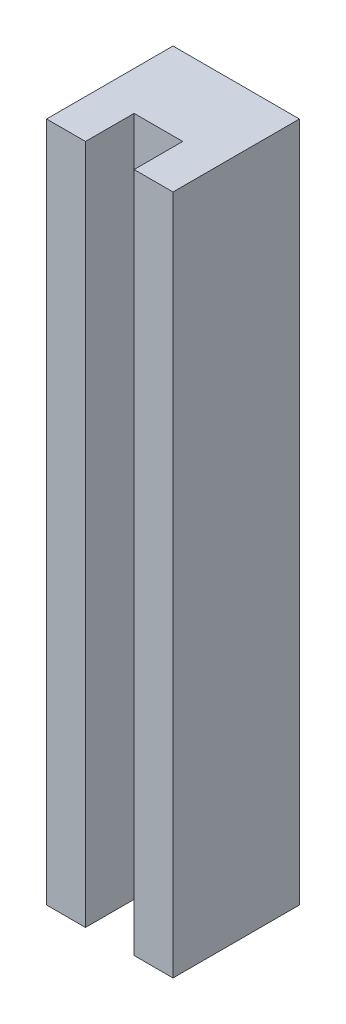
ISO-10303-21;
HEADER;
FILE_DESCRIPTION(('STEP AP214'),'2;1');
FILE_NAME('part.step','',(''),(''),'','','');
FILE_SCHEMA(('AUTOMOTIVE_DESIGN { 1 0 10303 214 1 1 1 1 }'));
ENDSEC;
DATA;
#1=APPLICATION_CONTEXT('core data for automotive mechanical design processes');
#2=APPLICATION_PROTOCOL_DEFINITION('international standard','automotive_design',2000,#1);
#3=PRODUCT_CONTEXT('',#1,'mechanical');
#4=PRODUCT('Part','Part','',(#3));
#5=PRODUCT_RELATED_PRODUCT_CATEGORY('part','',(#4));
#6=PRODUCT_DEFINITION_FORMATION('','',#4);
#7=PRODUCT_DEFINITION_CONTEXT('part definition',#1,'design');
#8=PRODUCT_DEFINITION('design','',#6,#7);
#9=PRODUCT_DEFINITION_SHAPE('','',#8);
#10=(LENGTH_UNIT() NAMED_UNIT(*) SI_UNIT(.MILLI.,.METRE.));
#11=(NAMED_UNIT(*) PLANE_ANGLE_UNIT() SI_UNIT($,.RADIAN.));
#12=(NAMED_UNIT(*) SI_UNIT($,.STERADIAN.) SOLID_ANGLE_UNIT());
#13=UNCERTAINTY_MEASURE_WITH_UNIT(LENGTH_MEASURE(1.E-05),#10,'distance_accuracy_value','');
#14=(GEOMETRIC_REPRESENTATION_CONTEXT(3) GLOBAL_UNCERTAINTY_ASSIGNED_CONTEXT((#13)) GLOBAL_UNIT_ASSIGNED_CONTEXT((#10,
#11,#12)) REPRESENTATION_CONTEXT('',''));
#15=CARTESIAN_POINT('',(0.,0.,0.));
#16=DIRECTION('',(0.,0.,1.));
#17=DIRECTION('',(1.,0.,0.));
#18=AXIS2_PLACEMENT_3D('',#15,#16,#17);
#19=CARTESIAN_POINT('',(0.,35.,6.5));
#20=DIRECTION('',(0.,0.,-1.));
#21=DIRECTION('',(-1.,0.,0.));
#22=AXIS2_PLACEMENT_3D('',#19,#20,#21);
#23=PLANE('',#22);
#24=DIRECTION('',(1.,0.,0.));
#25=VECTOR('',#24,1.);
#26=CARTESIAN_POINT('',(0.,0.,6.5));
#27=LINE('',#26,#25);
#28=CARTESIAN_POINT('',(0.,0.,6.5));
#29=VERTEX_POINT('',#28);
#30=CARTESIAN_POINT('',(2.,0.,6.5));
#31=VERTEX_POINT('',#30);
#32=EDGE_CURVE('E127',#29,#31,#27,.T.);
#33=ORIENTED_EDGE('',*,*,#32,.T.);
#34=DIRECTION('',(0.,1.,0.));
#35=VECTOR('',#34,1.);
#36=CARTESIAN_POINT('',(2.,0.,6.5));
#37=LINE('',#36,#35);
#38=CARTESIAN_POINT('',(2.,35.,6.5));
#39=VERTEX_POINT('',#38);
#40=EDGE_CURVE('E114',#31,#39,#37,.T.);
#41=ORIENTED_EDGE('',*,*,#40,.T.);
#42=DIRECTION('',(1.,0.,0.));
#43=VECTOR('',#42,1.);
#44=CARTESIAN_POINT('',(0.,35.,6.5));
#45=LINE('',#44,#43);
#46=CARTESIAN_POINT('',(0.,35.,6.5));
#47=VERTEX_POINT('',#46);
#48=EDGE_CURVE('E91',#47,#39,#45,.T.);
#49=ORIENTED_EDGE('',*,*,#48,.F.);
#50=DIRECTION('',(0.,-1.,0.));
#51=VECTOR('',#50,1.);
#52=CARTESIAN_POINT('',(0.,35.,6.5));
#53=LINE('',#52,#51);
#54=EDGE_CURVE('E11',#47,#29,#53,.T.);
#55=ORIENTED_EDGE('',*,*,#54,.T.);
#56=EDGE_LOOP('',(#33,#41,#49,#55));
#57=FACE_BOUND('',#56,.T.);
#58=ADVANCED_FACE('F39',(#57),#23,.F.);
#59=CARTESIAN_POINT('',(0.,35.,0.));
#60=DIRECTION('',(1.,0.,0.));
#61=DIRECTION('',(0.,0.,-1.));
#62=AXIS2_PLACEMENT_3D('',#59,#60,#61);
#63=PLANE('',#62);
#64=DIRECTION('',(0.,0.,1.));
#65=VECTOR('',#64,1.);
#66=CARTESIAN_POINT('',(0.,0.,0.));
#67=LINE('',#66,#65);
#68=CARTESIAN_POINT('',(0.,0.,0.));
#69=VERTEX_POINT('',#68);
#70=EDGE_CURVE('E137',#69,#29,#67,.T.);
#71=ORIENTED_EDGE('',*,*,#70,.T.);
#72=ORIENTED_EDGE('',*,*,#54,.F.);
#73=DIRECTION('',(0.,0.,1.));
#74=VECTOR('',#73,1.);
#75=CARTESIAN_POINT('',(0.,35.,0.));
#76=LINE('',#75,#74);
#77=CARTESIAN_POINT('',(0.,35.,0.));
#78=VERTEX_POINT('',#77);
#79=EDGE_CURVE('E142',#78,#47,#76,.T.);
#80=ORIENTED_EDGE('',*,*,#79,.F.);
#81=DIRECTION('',(0.,-1.,0.));
#82=VECTOR('',#81,1.);
#83=CARTESIAN_POINT('',(0.,35.,0.));
#84=LINE('',#83,#82);
#85=EDGE_CURVE('E143',#78,#69,#84,.T.);
#86=ORIENTED_EDGE('',*,*,#85,.T.);
#87=EDGE_LOOP('',(#71,#72,#80,#86));
#88=FACE_BOUND('',#87,.T.);
#89=ADVANCED_FACE('F41',(#88),#63,.F.);
#90=CARTESIAN_POINT('',(4.5,35.,6.5));
#91=VERTEX_POINT('',#90);
#92=CARTESIAN_POINT('',(6.5,35.,6.5));
#93=VERTEX_POINT('',#92);
#94=EDGE_CURVE('E165',#91,#93,#45,.T.);
#95=ORIENTED_EDGE('',*,*,#94,.F.);
#96=DIRECTION('',(0.,1.,0.));
#97=VECTOR('',#96,1.);
#98=CARTESIAN_POINT('',(4.5,0.,6.5));
#99=LINE('',#98,#97);
#100=CARTESIAN_POINT('',(4.5,0.,6.5));
#101=VERTEX_POINT('',#100);
#102=EDGE_CURVE('E122',#101,#91,#99,.T.);
#103=ORIENTED_EDGE('',*,*,#102,.F.);
#104=CARTESIAN_POINT('',(6.5,0.,6.5));
#105=VERTEX_POINT('',#104);
#106=EDGE_CURVE('E134',#101,#105,#27,.T.);
#107=ORIENTED_EDGE('',*,*,#106,.T.);
#108=DIRECTION('',(0.,-1.,0.));
#109=VECTOR('',#108,1.);
#110=CARTESIAN_POINT('',(6.5,35.,6.5));
#111=LINE('',#110,#109);
#112=EDGE_CURVE('E47',#93,#105,#111,.T.);
#113=ORIENTED_EDGE('',*,*,#112,.F.);
#114=EDGE_LOOP('',(#95,#103,#107,#113));
#115=FACE_BOUND('',#114,.T.);
#116=ADVANCED_FACE('F183',(#115),#23,.F.);
#117=CARTESIAN_POINT('',(6.5,35.,0.));
#118=DIRECTION('',(-1.,0.,0.));
#119=DIRECTION('',(0.,0.,1.));
#120=AXIS2_PLACEMENT_3D('',#117,#118,#119);
#121=PLANE('',#120);
#122=DIRECTION('',(0.,0.,-1.));
#123=VECTOR('',#122,1.);
#124=CARTESIAN_POINT('',(6.5,0.,0.));
#125=LINE('',#124,#123);
#126=CARTESIAN_POINT('',(6.5,0.,0.));
#127=VERTEX_POINT('',#126);
#128=EDGE_CURVE('E133',#105,#127,#125,.T.);
#129=ORIENTED_EDGE('',*,*,#128,.T.);
#130=DIRECTION('',(0.,-1.,0.));
#131=VECTOR('',#130,1.);
#132=CARTESIAN_POINT('',(6.5,35.,0.));
#133=LINE('',#132,#131);
#134=CARTESIAN_POINT('',(6.5,35.,0.));
#135=VERTEX_POINT('',#134);
#136=EDGE_CURVE('E145',#135,#127,#133,.T.);
#137=ORIENTED_EDGE('',*,*,#136,.F.);
#138=DIRECTION('',(0.,0.,-1.));
#139=VECTOR('',#138,1.);
#140=CARTESIAN_POINT('',(6.5,35.,0.));
#141=LINE('',#140,#139);
#142=EDGE_CURVE('E153',#93,#135,#141,.T.);
#143=ORIENTED_EDGE('',*,*,#142,.F.);
#144=ORIENTED_EDGE('',*,*,#112,.T.);
#145=EDGE_LOOP('',(#129,#137,#143,#144));
#146=FACE_BOUND('',#145,.T.);
#147=ADVANCED_FACE('F151',(#146),#121,.F.);
#148=CARTESIAN_POINT('',(0.,35.,0.));
#149=DIRECTION('',(0.,0.,1.));
#150=DIRECTION('',(1.,0.,0.));
#151=AXIS2_PLACEMENT_3D('',#148,#149,#150);
#152=PLANE('',#151);
#153=DIRECTION('',(-1.,0.,0.));
#154=VECTOR('',#153,1.);
#155=CARTESIAN_POINT('',(0.,0.,0.));
#156=LINE('',#155,#154);
#157=EDGE_CURVE('E84',#127,#69,#156,.T.);
#158=ORIENTED_EDGE('',*,*,#157,.T.);
#159=ORIENTED_EDGE('',*,*,#85,.F.);
#160=DIRECTION('',(-1.,0.,0.));
#161=VECTOR('',#160,1.);
#162=CARTESIAN_POINT('',(0.,35.,0.));
#163=LINE('',#162,#161);
#164=EDGE_CURVE('E63',#135,#78,#163,.T.);
#165=ORIENTED_EDGE('',*,*,#164,.F.);
#166=ORIENTED_EDGE('',*,*,#136,.T.);
#167=EDGE_LOOP('',(#158,#159,#165,#166));
#168=FACE_BOUND('',#167,.T.);
#169=ADVANCED_FACE('F169',(#168),#152,.F.);
#170=CARTESIAN_POINT('',(0.,35.,0.));
#171=DIRECTION('',(0.,1.,0.));
#172=DIRECTION('',(0.,0.,1.));
#173=AXIS2_PLACEMENT_3D('',#170,#171,#172);
#174=PLANE('',#173);
#175=DIRECTION('',(0.,0.,1.));
#176=VECTOR('',#175,1.);
#177=CARTESIAN_POINT('',(2.,35.,0.));
#178=LINE('',#177,#176);
#179=CARTESIAN_POINT('',(2.,35.,4.));
#180=VERTEX_POINT('',#179);
#181=EDGE_CURVE('E120',#180,#39,#178,.T.);
#182=ORIENTED_EDGE('',*,*,#181,.F.);
#183=DIRECTION('',(-1.,0.,0.));
#184=VECTOR('',#183,1.);
#185=CARTESIAN_POINT('',(0.,35.,4.));
#186=LINE('',#185,#184);
#187=CARTESIAN_POINT('',(4.5,35.,4.));
#188=VERTEX_POINT('',#187);
#189=EDGE_CURVE('E158',#188,#180,#186,.T.);
#190=ORIENTED_EDGE('',*,*,#189,.F.);
#191=DIRECTION('',(0.,0.,-1.));
#192=VECTOR('',#191,1.);
#193=CARTESIAN_POINT('',(4.5,35.,0.));
#194=LINE('',#193,#192);
#195=EDGE_CURVE('E160',#91,#188,#194,.T.);
#196=ORIENTED_EDGE('',*,*,#195,.F.);
#197=ORIENTED_EDGE('',*,*,#94,.T.);
#198=ORIENTED_EDGE('',*,*,#142,.T.);
#199=ORIENTED_EDGE('',*,*,#164,.T.);
#200=ORIENTED_EDGE('',*,*,#79,.T.);
#201=ORIENTED_EDGE('',*,*,#48,.T.);
#202=EDGE_LOOP('',(#182,#190,#196,#197,#198,#199,#200,#201));
#203=FACE_BOUND('',#202,.T.);
#204=ADVANCED_FACE('F167',(#203),#174,.T.);
#205=CARTESIAN_POINT('',(0.,0.,0.));
#206=DIRECTION('',(0.,1.,0.));
#207=DIRECTION('',(0.,0.,1.));
#208=AXIS2_PLACEMENT_3D('',#205,#206,#207);
#209=PLANE('',#208);
#210=DIRECTION('',(-1.,0.,0.));
#211=VECTOR('',#210,1.);
#212=CARTESIAN_POINT('',(2.,0.,4.));
#213=LINE('',#212,#211);
#214=CARTESIAN_POINT('',(4.5,0.,4.));
#215=VERTEX_POINT('',#214);
#216=CARTESIAN_POINT('',(2.,0.,4.));
#217=VERTEX_POINT('',#216);
#218=EDGE_CURVE('E54',#215,#217,#213,.T.);
#219=ORIENTED_EDGE('',*,*,#218,.T.);
#220=DIRECTION('',(0.,0.,1.));
#221=VECTOR('',#220,1.);
#222=CARTESIAN_POINT('',(2.,0.,6.5));
#223=LINE('',#222,#221);
#224=EDGE_CURVE('E118',#217,#31,#223,.T.);
#225=ORIENTED_EDGE('',*,*,#224,.T.);
#226=ORIENTED_EDGE('',*,*,#32,.F.);
#227=ORIENTED_EDGE('',*,*,#70,.F.);
#228=ORIENTED_EDGE('',*,*,#157,.F.);
#229=ORIENTED_EDGE('',*,*,#128,.F.);
#230=ORIENTED_EDGE('',*,*,#106,.F.);
#231=DIRECTION('',(0.,0.,-1.));
#232=VECTOR('',#231,1.);
#233=CARTESIAN_POINT('',(4.5,0.,6.5));
#234=LINE('',#233,#232);
#235=EDGE_CURVE('E129',#101,#215,#234,.T.);
#236=ORIENTED_EDGE('',*,*,#235,.T.);
#237=EDGE_LOOP('',(#219,#225,#226,#227,#228,#229,#230,#236));
#238=FACE_BOUND('',#237,.T.);
#239=ADVANCED_FACE('F125',(#238),#209,.F.);
#240=CARTESIAN_POINT('',(2.,0.,6.5));
#241=DIRECTION('',(-1.,0.,0.));
#242=DIRECTION('',(0.,0.,1.));
#243=AXIS2_PLACEMENT_3D('',#240,#241,#242);
#244=PLANE('',#243);
#245=ORIENTED_EDGE('',*,*,#181,.T.);
#246=ORIENTED_EDGE('',*,*,#40,.F.);
#247=ORIENTED_EDGE('',*,*,#224,.F.);
#248=DIRECTION('',(0.,1.,0.));
#249=VECTOR('',#248,1.);
#250=CARTESIAN_POINT('',(2.,0.,4.));
#251=LINE('',#250,#249);
#252=EDGE_CURVE('E173',#217,#180,#251,.T.);
#253=ORIENTED_EDGE('',*,*,#252,.T.);
#254=EDGE_LOOP('',(#245,#246,#247,#253));
#255=FACE_BOUND('',#254,.T.);
#256=ADVANCED_FACE('F116',(#255),#244,.F.);
#257=CARTESIAN_POINT('',(2.,0.,4.));
#258=DIRECTION('',(0.,0.,-1.));
#259=DIRECTION('',(-1.,0.,0.));
#260=AXIS2_PLACEMENT_3D('',#257,#258,#259);
#261=PLANE('',#260);
#262=ORIENTED_EDGE('',*,*,#189,.T.);
#263=ORIENTED_EDGE('',*,*,#252,.F.);
#264=ORIENTED_EDGE('',*,*,#218,.F.);
#265=DIRECTION('',(0.,1.,0.));
#266=VECTOR('',#265,1.);
#267=CARTESIAN_POINT('',(4.5,0.,4.));
#268=LINE('',#267,#266);
#269=EDGE_CURVE('E174',#215,#188,#268,.T.);
#270=ORIENTED_EDGE('',*,*,#269,.T.);
#271=EDGE_LOOP('',(#262,#263,#264,#270));
#272=FACE_BOUND('',#271,.T.);
#273=ADVANCED_FACE('F172',(#272),#261,.F.);
#274=CARTESIAN_POINT('',(4.5,0.,6.5));
#275=DIRECTION('',(1.,0.,0.));
#276=DIRECTION('',(0.,0.,-1.));
#277=AXIS2_PLACEMENT_3D('',#274,#275,#276);
#278=PLANE('',#277);
#279=ORIENTED_EDGE('',*,*,#195,.T.);
#280=ORIENTED_EDGE('',*,*,#269,.F.);
#281=ORIENTED_EDGE('',*,*,#235,.F.);
#282=ORIENTED_EDGE('',*,*,#102,.T.);
#283=EDGE_LOOP('',(#279,#280,#281,#282));
#284=FACE_BOUND('',#283,.T.);
#285=ADVANCED_FACE('F182',(#284),#278,.F.);
#286=CLOSED_SHELL('',(#58,#89,#116,#147,#169,#204,#239,#256,#273,#285));
#287=MANIFOLD_SOLID_BREP('B2',#286);
#288=ADVANCED_BREP_SHAPE_REPRESENTATION('',(#18,#287),#14);
#289=SHAPE_DEFINITION_REPRESENTATION(#9,#288);
ENDSEC;
END-ISO-10303-21;
